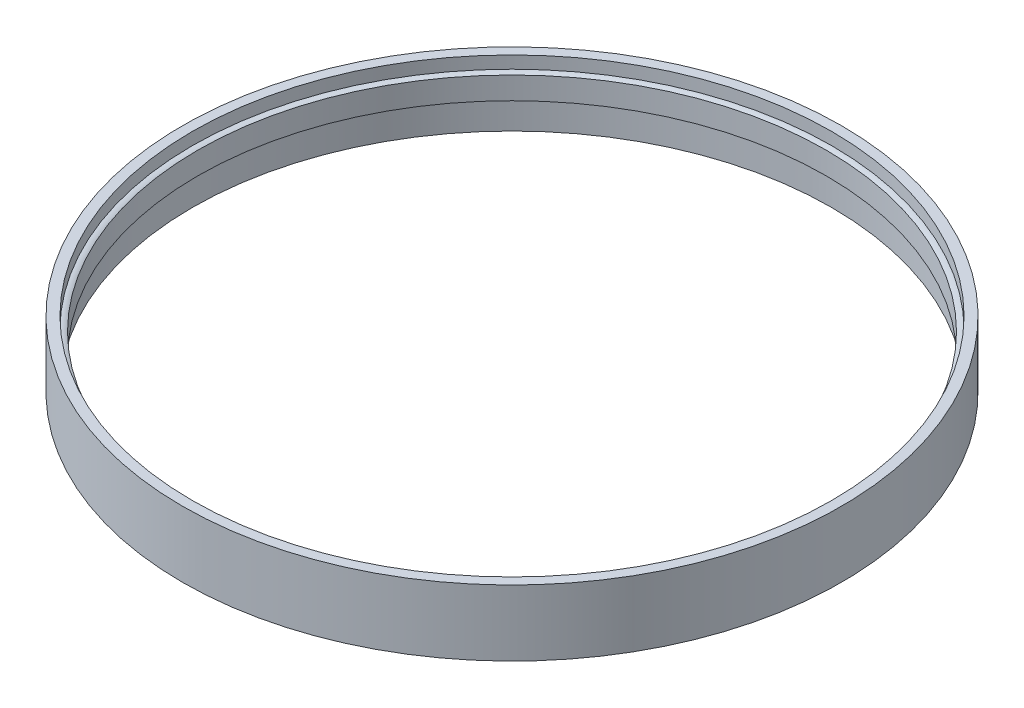
ISO-10303-21;
HEADER;
FILE_DESCRIPTION(('STEP AP214'),'2;1');
FILE_NAME('part.step','',(''),(''),'','','');
FILE_SCHEMA(('AUTOMOTIVE_DESIGN { 1 0 10303 214 1 1 1 1 }'));
ENDSEC;
DATA;
#1=APPLICATION_CONTEXT('core data for automotive mechanical design processes');
#2=APPLICATION_PROTOCOL_DEFINITION('international standard','automotive_design',2000,#1);
#3=PRODUCT_CONTEXT('',#1,'mechanical');
#4=PRODUCT('Part','Part','',(#3));
#5=PRODUCT_RELATED_PRODUCT_CATEGORY('part','',(#4));
#6=PRODUCT_DEFINITION_FORMATION('','',#4);
#7=PRODUCT_DEFINITION_CONTEXT('part definition',#1,'design');
#8=PRODUCT_DEFINITION('design','',#6,#7);
#9=PRODUCT_DEFINITION_SHAPE('','',#8);
#10=(LENGTH_UNIT() NAMED_UNIT(*) SI_UNIT(.MILLI.,.METRE.));
#11=(NAMED_UNIT(*) PLANE_ANGLE_UNIT() SI_UNIT($,.RADIAN.));
#12=(NAMED_UNIT(*) SI_UNIT($,.STERADIAN.) SOLID_ANGLE_UNIT());
#13=UNCERTAINTY_MEASURE_WITH_UNIT(LENGTH_MEASURE(1.E-05),#10,'distance_accuracy_value','');
#14=(GEOMETRIC_REPRESENTATION_CONTEXT(3) GLOBAL_UNCERTAINTY_ASSIGNED_CONTEXT((#13)) GLOBAL_UNIT_ASSIGNED_CONTEXT((#10,
#11,#12)) REPRESENTATION_CONTEXT('',''));
#15=CARTESIAN_POINT('',(0.,0.,0.));
#16=DIRECTION('',(0.,0.,1.));
#17=DIRECTION('',(1.,0.,0.));
#18=AXIS2_PLACEMENT_3D('',#15,#16,#17);
#19=CARTESIAN_POINT('',(-40.,8.,0.));
#20=DIRECTION('',(0.,-1.,0.));
#21=DIRECTION('',(0.,0.,-1.));
#22=AXIS2_PLACEMENT_3D('',#19,#20,#21);
#23=PLANE('',#22);
#24=CARTESIAN_POINT('',(0.,8.,0.));
#25=DIRECTION('',(0.,-1.,0.));
#26=DIRECTION('',(0.,0.,-1.));
#27=AXIS2_PLACEMENT_3D('',#24,#25,#26);
#28=CIRCLE('',#27,40.);
#29=CARTESIAN_POINT('',(0.,8.,-40.));
#30=VERTEX_POINT('',#29);
#31=EDGE_CURVE('E10',#30,#30,#28,.T.);
#32=ORIENTED_EDGE('',*,*,#31,.F.);
#33=EDGE_LOOP('',(#32));
#34=FACE_BOUND('',#33,.T.);
#35=CARTESIAN_POINT('',(0.,8.,0.));
#36=DIRECTION('',(0.,-1.,0.));
#37=DIRECTION('',(0.,0.,-1.));
#38=AXIS2_PLACEMENT_3D('',#35,#36,#37);
#39=CIRCLE('',#38,38.8);
#40=CARTESIAN_POINT('',(0.,8.,-38.8));
#41=VERTEX_POINT('',#40);
#42=EDGE_CURVE('E59',#41,#41,#39,.T.);
#43=ORIENTED_EDGE('',*,*,#42,.T.);
#44=EDGE_LOOP('',(#43));
#45=FACE_BOUND('',#44,.T.);
#46=ADVANCED_FACE('F31',(#34,#45),#23,.F.);
#47=CARTESIAN_POINT('',(0.,0.,0.));
#48=DIRECTION('',(0.,-1.,0.));
#49=DIRECTION('',(0.,0.,-1.));
#50=AXIS2_PLACEMENT_3D('',#47,#48,#49);
#51=CYLINDRICAL_SURFACE('',#50,40.);
#52=CARTESIAN_POINT('',(0.,0.,0.));
#53=DIRECTION('',(0.,-1.,0.));
#54=DIRECTION('',(0.,0.,-1.));
#55=AXIS2_PLACEMENT_3D('',#52,#53,#54);
#56=CIRCLE('',#55,40.);
#57=CARTESIAN_POINT('',(0.,0.,-40.));
#58=VERTEX_POINT('',#57);
#59=EDGE_CURVE('E37',#58,#58,#56,.T.);
#60=ORIENTED_EDGE('',*,*,#59,.F.);
#61=EDGE_LOOP('',(#60));
#62=FACE_BOUND('',#61,.T.);
#63=ORIENTED_EDGE('',*,*,#31,.T.);
#64=EDGE_LOOP('',(#63));
#65=FACE_BOUND('',#64,.T.);
#66=ADVANCED_FACE('F96',(#62,#65),#51,.T.);
#67=CARTESIAN_POINT('',(-40.,0.,0.));
#68=DIRECTION('',(0.,1.,0.));
#69=DIRECTION('',(0.,0.,1.));
#70=AXIS2_PLACEMENT_3D('',#67,#68,#69);
#71=PLANE('',#70);
#72=CARTESIAN_POINT('',(0.,0.,0.));
#73=DIRECTION('',(0.,-1.,0.));
#74=DIRECTION('',(0.,0.,-1.));
#75=AXIS2_PLACEMENT_3D('',#72,#73,#74);
#76=CIRCLE('',#75,38.8);
#77=CARTESIAN_POINT('',(0.,0.,-38.8));
#78=VERTEX_POINT('',#77);
#79=EDGE_CURVE('E41',#78,#78,#76,.T.);
#80=ORIENTED_EDGE('',*,*,#79,.F.);
#81=EDGE_LOOP('',(#80));
#82=FACE_BOUND('',#81,.T.);
#83=ORIENTED_EDGE('',*,*,#59,.T.);
#84=EDGE_LOOP('',(#83));
#85=FACE_BOUND('',#84,.T.);
#86=ADVANCED_FACE('F91',(#82,#85),#71,.F.);
#87=CARTESIAN_POINT('',(0.,0.,0.));
#88=DIRECTION('',(0.,-1.,0.));
#89=DIRECTION('',(0.,0.,-1.));
#90=AXIS2_PLACEMENT_3D('',#87,#88,#89);
#91=CYLINDRICAL_SURFACE('',#90,38.8);
#92=CARTESIAN_POINT('',(0.,3.5,0.));
#93=DIRECTION('',(0.,-1.,0.));
#94=DIRECTION('',(0.,0.,-1.));
#95=AXIS2_PLACEMENT_3D('',#92,#93,#94);
#96=CIRCLE('',#95,38.8);
#97=CARTESIAN_POINT('',(0.,3.5,-38.8));
#98=VERTEX_POINT('',#97);
#99=EDGE_CURVE('E45',#98,#98,#96,.T.);
#100=ORIENTED_EDGE('',*,*,#99,.F.);
#101=EDGE_LOOP('',(#100));
#102=FACE_BOUND('',#101,.T.);
#103=ORIENTED_EDGE('',*,*,#79,.T.);
#104=EDGE_LOOP('',(#103));
#105=FACE_BOUND('',#104,.T.);
#106=ADVANCED_FACE('F85',(#102,#105),#91,.F.);
#107=CARTESIAN_POINT('',(0.,5.,0.));
#108=DIRECTION('',(0.,-1.,0.));
#109=DIRECTION('',(0.,0.,-1.));
#110=AXIS2_PLACEMENT_3D('',#107,#108,#109);
#111=TOROIDAL_SURFACE('',#110,38.8,1.5);
#112=CARTESIAN_POINT('',(0.,3.64814941654043,0.));
#113=DIRECTION('',(0.,-1.,0.));
#114=DIRECTION('',(0.,0.,-1.));
#115=AXIS2_PLACEMENT_3D('',#112,#113,#114);
#116=CIRCLE('',#115,38.15);
#117=CARTESIAN_POINT('',(0.,3.64814941654043,-38.15));
#118=VERTEX_POINT('',#117);
#119=EDGE_CURVE('E50',#118,#118,#116,.T.);
#120=ORIENTED_EDGE('',*,*,#119,.F.);
#121=EDGE_LOOP('',(#120));
#122=FACE_BOUND('',#121,.T.);
#123=ORIENTED_EDGE('',*,*,#99,.T.);
#124=EDGE_LOOP('',(#123));
#125=FACE_BOUND('',#124,.T.);
#126=ADVANCED_FACE('F79',(#122,#125),#111,.T.);
#127=CARTESIAN_POINT('',(0.,0.,0.));
#128=DIRECTION('',(0.,-1.,0.));
#129=DIRECTION('',(0.,0.,-1.));
#130=AXIS2_PLACEMENT_3D('',#127,#128,#129);
#131=CYLINDRICAL_SURFACE('',#130,38.15);
#132=CARTESIAN_POINT('',(0.,6.35185058345957,0.));
#133=DIRECTION('',(0.,-1.,0.));
#134=DIRECTION('',(0.,0.,-1.));
#135=AXIS2_PLACEMENT_3D('',#132,#133,#134);
#136=CIRCLE('',#135,38.15);
#137=CARTESIAN_POINT('',(0.,6.35185058345957,-38.15));
#138=VERTEX_POINT('',#137);
#139=EDGE_CURVE('E53',#138,#138,#136,.T.);
#140=ORIENTED_EDGE('',*,*,#139,.F.);
#141=EDGE_LOOP('',(#140));
#142=FACE_BOUND('',#141,.T.);
#143=ORIENTED_EDGE('',*,*,#119,.T.);
#144=EDGE_LOOP('',(#143));
#145=FACE_BOUND('',#144,.T.);
#146=ADVANCED_FACE('F73',(#142,#145),#131,.F.);
#147=CARTESIAN_POINT('',(0.,5.,0.));
#148=DIRECTION('',(0.,-1.,0.));
#149=DIRECTION('',(0.,0.,-1.));
#150=AXIS2_PLACEMENT_3D('',#147,#148,#149);
#151=TOROIDAL_SURFACE('',#150,38.8,1.5);
#152=CARTESIAN_POINT('',(0.,6.5,0.));
#153=DIRECTION('',(0.,-1.,0.));
#154=DIRECTION('',(0.,0.,-1.));
#155=AXIS2_PLACEMENT_3D('',#152,#153,#154);
#156=CIRCLE('',#155,38.8);
#157=CARTESIAN_POINT('',(0.,6.5,-38.8));
#158=VERTEX_POINT('',#157);
#159=EDGE_CURVE('E56',#158,#158,#156,.T.);
#160=ORIENTED_EDGE('',*,*,#159,.F.);
#161=EDGE_LOOP('',(#160));
#162=FACE_BOUND('',#161,.T.);
#163=ORIENTED_EDGE('',*,*,#139,.T.);
#164=EDGE_LOOP('',(#163));
#165=FACE_BOUND('',#164,.T.);
#166=ADVANCED_FACE('F67',(#162,#165),#151,.T.);
#167=CARTESIAN_POINT('',(0.,0.,0.));
#168=DIRECTION('',(0.,-1.,0.));
#169=DIRECTION('',(0.,0.,-1.));
#170=AXIS2_PLACEMENT_3D('',#167,#168,#169);
#171=CYLINDRICAL_SURFACE('',#170,38.8);
#172=ORIENTED_EDGE('',*,*,#42,.F.);
#173=EDGE_LOOP('',(#172));
#174=FACE_BOUND('',#173,.T.);
#175=ORIENTED_EDGE('',*,*,#159,.T.);
#176=EDGE_LOOP('',(#175));
#177=FACE_BOUND('',#176,.T.);
#178=ADVANCED_FACE('F64',(#174,#177),#171,.F.);
#179=CLOSED_SHELL('',(#46,#66,#86,#106,#126,#146,#166,#178));
#180=MANIFOLD_SOLID_BREP('B2',#179);
#181=ADVANCED_BREP_SHAPE_REPRESENTATION('',(#18,#180),#14);
#182=SHAPE_DEFINITION_REPRESENTATION(#9,#181);
ENDSEC;
END-ISO-10303-21;
